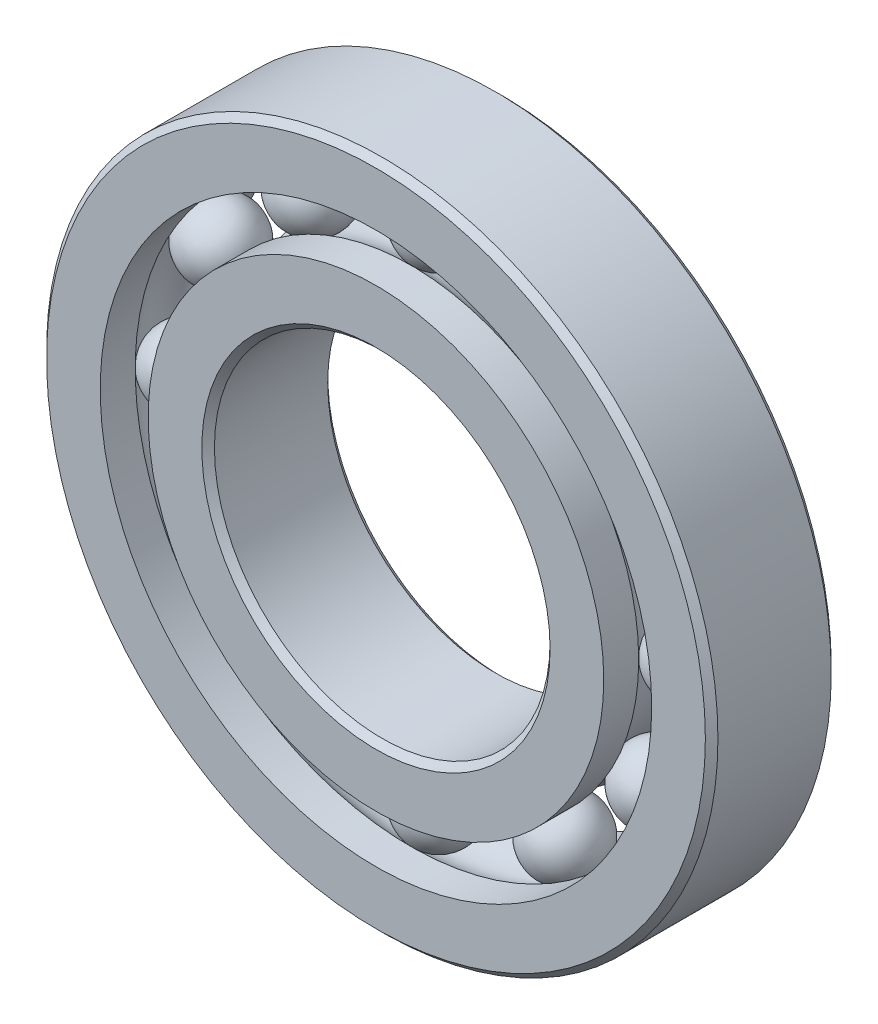
ISO-10303-21;
HEADER;
FILE_DESCRIPTION(('STEP AP214'),'2;1');
FILE_NAME('part.step','',(''),(''),'','','');
FILE_SCHEMA(('AUTOMOTIVE_DESIGN { 1 0 10303 214 1 1 1 1 }'));
ENDSEC;
DATA;
#1=APPLICATION_CONTEXT('core data for automotive mechanical design processes');
#2=APPLICATION_PROTOCOL_DEFINITION('international standard','automotive_design',2000,#1);
#3=PRODUCT_CONTEXT('',#1,'mechanical');
#4=PRODUCT('Part','Part','',(#3));
#5=PRODUCT_RELATED_PRODUCT_CATEGORY('part','',(#4));
#6=PRODUCT_DEFINITION_FORMATION('','',#4);
#7=PRODUCT_DEFINITION_CONTEXT('part definition',#1,'design');
#8=PRODUCT_DEFINITION('design','',#6,#7);
#9=PRODUCT_DEFINITION_SHAPE('','',#8);
#10=(LENGTH_UNIT() NAMED_UNIT(*) SI_UNIT(.MILLI.,.METRE.));
#11=(NAMED_UNIT(*) PLANE_ANGLE_UNIT() SI_UNIT($,.RADIAN.));
#12=(NAMED_UNIT(*) SI_UNIT($,.STERADIAN.) SOLID_ANGLE_UNIT());
#13=UNCERTAINTY_MEASURE_WITH_UNIT(LENGTH_MEASURE(1.E-05),#10,'distance_accuracy_value','');
#14=(GEOMETRIC_REPRESENTATION_CONTEXT(3) GLOBAL_UNCERTAINTY_ASSIGNED_CONTEXT((#13)) GLOBAL_UNIT_ASSIGNED_CONTEXT((#10,
#11,#12)) REPRESENTATION_CONTEXT('',''));
#15=CARTESIAN_POINT('',(0.,0.,0.));
#16=DIRECTION('',(0.,0.,1.));
#17=DIRECTION('',(1.,0.,0.));
#18=AXIS2_PLACEMENT_3D('',#15,#16,#17);
#19=CARTESIAN_POINT('',(-9.52499999999979,16.4977839420937,0.));
#20=DIRECTION('',(0.,0.,1.));
#21=DIRECTION('',(-0.499999999999989,0.866025403784445,0.));
#22=AXIS2_PLACEMENT_3D('',#19,#20,#21);
#23=SPHERICAL_SURFACE('',#22,2.78781463351475);
#24=CARTESIAN_POINT('',(-9.52499999999979,16.4977839420937,2.78781463351475));
#25=VERTEX_POINT('',#24);
#26=VERTEX_LOOP('',#25);
#27=FACE_BOUND('',#26,.T.);
#28=ADVANCED_FACE('F41',(#27),#23,.T.);
#29=CLOSED_SHELL('',(#28));
#30=MANIFOLD_SOLID_BREP('B2',#29);
#31=CARTESIAN_POINT('',(-16.4977839420934,9.52500000000019,0.));
#32=DIRECTION('',(0.,0.,1.));
#33=DIRECTION('',(-0.866025403784433,0.50000000000001,0.));
#34=AXIS2_PLACEMENT_3D('',#31,#32,#33);
#35=SPHERICAL_SURFACE('',#34,2.78781463351475);
#36=CARTESIAN_POINT('',(-16.4977839420934,9.52500000000019,2.78781463351475));
#37=VERTEX_POINT('',#36);
#38=VERTEX_LOOP('',#37);
#39=FACE_BOUND('',#38,.T.);
#40=ADVANCED_FACE('F61',(#39),#35,.T.);
#41=CLOSED_SHELL('',(#40));
#42=MANIFOLD_SOLID_BREP('B6',#41);
#43=CARTESIAN_POINT('',(-19.05,1.99538158514885E-13,0.));
#44=DIRECTION('',(0.,0.,1.));
#45=DIRECTION('',(-1.,0.,0.));
#46=AXIS2_PLACEMENT_3D('',#43,#44,#45);
#47=SPHERICAL_SURFACE('',#46,2.78781463351475);
#48=CARTESIAN_POINT('',(-19.05,1.99538158514885E-13,2.78781463351475));
#49=VERTEX_POINT('',#48);
#50=VERTEX_LOOP('',#49);
#51=FACE_BOUND('',#50,.T.);
#52=ADVANCED_FACE('F81',(#51),#47,.T.);
#53=CLOSED_SHELL('',(#52));
#54=MANIFOLD_SOLID_BREP('B37',#53);
#55=CARTESIAN_POINT('',(-16.4977839420936,-9.52499999999985,0.));
#56=DIRECTION('',(0.,0.,1.));
#57=DIRECTION('',(-0.866025403784443,-0.499999999999992,0.));
#58=AXIS2_PLACEMENT_3D('',#55,#56,#57);
#59=SPHERICAL_SURFACE('',#58,2.78781463351475);
#60=CARTESIAN_POINT('',(-16.4977839420936,-9.52499999999985,2.78781463351475));
#61=VERTEX_POINT('',#60);
#62=VERTEX_LOOP('',#61);
#63=FACE_BOUND('',#62,.T.);
#64=ADVANCED_FACE('F101',(#63),#59,.T.);
#65=CLOSED_SHELL('',(#64));
#66=MANIFOLD_SOLID_BREP('B57',#65);
#67=CARTESIAN_POINT('',(-9.52500000000013,-16.4977839420935,0.));
#68=DIRECTION('',(0.,0.,1.));
#69=DIRECTION('',(-0.500000000000007,-0.866025403784435,0.));
#70=AXIS2_PLACEMENT_3D('',#67,#68,#69);
#71=SPHERICAL_SURFACE('',#70,2.78781463351475);
#72=CARTESIAN_POINT('',(-9.52500000000013,-16.4977839420935,2.78781463351475));
#73=VERTEX_POINT('',#72);
#74=VERTEX_LOOP('',#73);
#75=FACE_BOUND('',#74,.T.);
#76=ADVANCED_FACE('F121',(#75),#71,.T.);
#77=CLOSED_SHELL('',(#76));
#78=MANIFOLD_SOLID_BREP('B77',#77);
#79=CARTESIAN_POINT('',(-1.33025439009923E-13,-19.05,0.));
#80=DIRECTION('',(0.,0.,1.));
#81=DIRECTION('',(0.,-1.,0.));
#82=AXIS2_PLACEMENT_3D('',#79,#80,#81);
#83=SPHERICAL_SURFACE('',#82,2.78781463351475);
#84=CARTESIAN_POINT('',(-1.33025439009923E-13,-19.05,2.78781463351475));
#85=VERTEX_POINT('',#84);
#86=VERTEX_LOOP('',#85);
#87=FACE_BOUND('',#86,.T.);
#88=ADVANCED_FACE('F141',(#87),#83,.T.);
#89=CLOSED_SHELL('',(#88));
#90=MANIFOLD_SOLID_BREP('B97',#89);
#91=CARTESIAN_POINT('',(9.5249999999999,-16.4977839420936,0.));
#92=DIRECTION('',(0.,0.,1.));
#93=DIRECTION('',(0.499999999999995,-0.866025403784442,0.));
#94=AXIS2_PLACEMENT_3D('',#91,#92,#93);
#95=SPHERICAL_SURFACE('',#94,2.78781463351475);
#96=CARTESIAN_POINT('',(9.5249999999999,-16.4977839420936,2.78781463351475));
#97=VERTEX_POINT('',#96);
#98=VERTEX_LOOP('',#97);
#99=FACE_BOUND('',#98,.T.);
#100=ADVANCED_FACE('F161',(#99),#95,.T.);
#101=CLOSED_SHELL('',(#100));
#102=MANIFOLD_SOLID_BREP('B117',#101);
#103=CARTESIAN_POINT('',(16.4977839420935,-9.52500000000008,0.));
#104=DIRECTION('',(0.,0.,1.));
#105=DIRECTION('',(0.866025403784436,-0.500000000000004,0.));
#106=AXIS2_PLACEMENT_3D('',#103,#104,#105);
#107=SPHERICAL_SURFACE('',#106,2.78781463351475);
#108=CARTESIAN_POINT('',(16.4977839420935,-9.52500000000008,2.78781463351475));
#109=VERTEX_POINT('',#108);
#110=VERTEX_LOOP('',#109);
#111=FACE_BOUND('',#110,.T.);
#112=ADVANCED_FACE('F181',(#111),#107,.T.);
#113=CLOSED_SHELL('',(#112));
#114=MANIFOLD_SOLID_BREP('B137',#113);
#115=CARTESIAN_POINT('',(19.05,0.,0.));
#116=DIRECTION('',(0.,0.,1.));
#117=DIRECTION('',(1.,0.,0.));
#118=AXIS2_PLACEMENT_3D('',#115,#116,#117);
#119=SPHERICAL_SURFACE('',#118,2.78781463351475);
#120=CARTESIAN_POINT('',(19.05,0.,2.78781463351475));
#121=VERTEX_POINT('',#120);
#122=VERTEX_LOOP('',#121);
#123=FACE_BOUND('',#122,.T.);
#124=ADVANCED_FACE('F201',(#123),#119,.T.);
#125=CLOSED_SHELL('',(#124));
#126=MANIFOLD_SOLID_BREP('B157',#125);
#127=CARTESIAN_POINT('',(16.4977839420936,9.52499999999996,0.));
#128=DIRECTION('',(0.,0.,1.));
#129=DIRECTION('',(0.86602540378444,0.499999999999998,0.));
#130=AXIS2_PLACEMENT_3D('',#127,#128,#129);
#131=SPHERICAL_SURFACE('',#130,2.78781463351475);
#132=CARTESIAN_POINT('',(16.4977839420936,9.52499999999996,2.78781463351475));
#133=VERTEX_POINT('',#132);
#134=VERTEX_LOOP('',#133);
#135=FACE_BOUND('',#134,.T.);
#136=ADVANCED_FACE('F221',(#135),#131,.T.);
#137=CLOSED_SHELL('',(#136));
#138=MANIFOLD_SOLID_BREP('B177',#137);
#139=CARTESIAN_POINT('',(9.52500000000002,16.4977839420935,0.));
#140=DIRECTION('',(0.,0.,1.));
#141=DIRECTION('',(0.500000000000001,0.866025403784438,0.));
#142=AXIS2_PLACEMENT_3D('',#139,#140,#141);
#143=SPHERICAL_SURFACE('',#142,2.78781463351475);
#144=CARTESIAN_POINT('',(9.52500000000002,16.4977839420935,2.78781463351475));
#145=VERTEX_POINT('',#144);
#146=VERTEX_LOOP('',#145);
#147=FACE_BOUND('',#146,.T.);
#148=ADVANCED_FACE('F241',(#147),#143,.T.);
#149=CLOSED_SHELL('',(#148));
#150=MANIFOLD_SOLID_BREP('B197',#149);
#151=CARTESIAN_POINT('',(0.,19.05,0.));
#152=DIRECTION('',(0.,0.,1.));
#153=DIRECTION('',(0.,1.,0.));
#154=AXIS2_PLACEMENT_3D('',#151,#152,#153);
#155=SPHERICAL_SURFACE('',#154,2.78781463351475);
#156=CARTESIAN_POINT('',(0.,19.05,2.78781463351475));
#157=VERTEX_POINT('',#156);
#158=VERTEX_LOOP('',#157);
#159=FACE_BOUND('',#158,.T.);
#160=ADVANCED_FACE('F263',(#159),#155,.T.);
#161=CLOSED_SHELL('',(#160));
#162=MANIFOLD_SOLID_BREP('B217',#161);
#163=CARTESIAN_POINT('',(0.,17.2357142857143,4.7625));
#164=DIRECTION('',(0.,0.,-1.));
#165=DIRECTION('',(-1.,0.,0.));
#166=AXIS2_PLACEMENT_3D('',#163,#164,#165);
#167=PLANE('',#166);
#168=CARTESIAN_POINT('',(0.,0.,4.7625));
#169=DIRECTION('',(0.,0.,1.));
#170=DIRECTION('',(1.,0.,0.));
#171=AXIS2_PLACEMENT_3D('',#168,#169,#170);
#172=CIRCLE('',#171,13.17625);
#173=CARTESIAN_POINT('',(13.17625,0.,4.7625));
#174=VERTEX_POINT('',#173);
#175=EDGE_CURVE('E310',#174,#174,#172,.T.);
#176=ORIENTED_EDGE('',*,*,#175,.F.);
#177=EDGE_LOOP('',(#176));
#178=FACE_BOUND('',#177,.T.);
#179=CARTESIAN_POINT('',(0.,0.,4.7625));
#180=DIRECTION('',(0.,0.,1.));
#181=DIRECTION('',(1.,0.,0.));
#182=AXIS2_PLACEMENT_3D('',#179,#180,#181);
#183=CIRCLE('',#182,17.2357142857143);
#184=CARTESIAN_POINT('',(17.2357142857143,0.,4.7625));
#185=VERTEX_POINT('',#184);
#186=EDGE_CURVE('E262',#185,#185,#183,.T.);
#187=ORIENTED_EDGE('',*,*,#186,.T.);
#188=EDGE_LOOP('',(#187));
#189=FACE_BOUND('',#188,.T.);
#190=ADVANCED_FACE('F282',(#178,#189),#167,.F.);
#191=CARTESIAN_POINT('',(0.,0.,4.7625));
#192=DIRECTION('',(0.,0.,1.));
#193=DIRECTION('',(1.,0.,0.));
#194=AXIS2_PLACEMENT_3D('',#191,#192,#193);
#195=CYLINDRICAL_SURFACE('',#194,17.2357142857143);
#196=ORIENTED_EDGE('',*,*,#186,.F.);
#197=EDGE_LOOP('',(#196));
#198=FACE_BOUND('',#197,.T.);
#199=CARTESIAN_POINT('',(0.,0.,2.11666666666667));
#200=DIRECTION('',(0.,0.,1.));
#201=DIRECTION('',(1.,0.,0.));
#202=AXIS2_PLACEMENT_3D('',#199,#200,#201);
#203=CIRCLE('',#202,17.2357142857143);
#204=CARTESIAN_POINT('',(17.2357142857143,0.,2.11666666666667));
#205=VERTEX_POINT('',#204);
#206=EDGE_CURVE('E288',#205,#205,#203,.T.);
#207=ORIENTED_EDGE('',*,*,#206,.T.);
#208=EDGE_LOOP('',(#207));
#209=FACE_BOUND('',#208,.T.);
#210=ADVANCED_FACE('F317',(#198,#209),#195,.T.);
#211=CARTESIAN_POINT('',(0.,0.,0.));
#212=DIRECTION('',(0.,0.,1.));
#213=DIRECTION('',(1.,0.,0.));
#214=AXIS2_PLACEMENT_3D('',#211,#212,#213);
#215=TOROIDAL_SURFACE('',#214,19.05,2.78781463351475);
#216=ORIENTED_EDGE('',*,*,#206,.F.);
#217=EDGE_LOOP('',(#216));
#218=FACE_BOUND('',#217,.T.);
#219=CARTESIAN_POINT('',(0.,0.,-2.11666666666667));
#220=DIRECTION('',(0.,0.,1.));
#221=DIRECTION('',(1.,0.,0.));
#222=AXIS2_PLACEMENT_3D('',#219,#220,#221);
#223=CIRCLE('',#222,17.2357142857143);
#224=CARTESIAN_POINT('',(17.2357142857143,0.,-2.11666666666667));
#225=VERTEX_POINT('',#224);
#226=EDGE_CURVE('E292',#225,#225,#223,.T.);
#227=ORIENTED_EDGE('',*,*,#226,.T.);
#228=EDGE_LOOP('',(#227));
#229=FACE_BOUND('',#228,.T.);
#230=ADVANCED_FACE('F321',(#218,#229),#215,.F.);
#231=CARTESIAN_POINT('',(0.,0.,4.7625));
#232=DIRECTION('',(0.,0.,1.));
#233=DIRECTION('',(1.,0.,0.));
#234=AXIS2_PLACEMENT_3D('',#231,#232,#233);
#235=CYLINDRICAL_SURFACE('',#234,17.2357142857143);
#236=ORIENTED_EDGE('',*,*,#226,.F.);
#237=EDGE_LOOP('',(#236));
#238=FACE_BOUND('',#237,.T.);
#239=CARTESIAN_POINT('',(0.,0.,-4.7625));
#240=DIRECTION('',(0.,0.,1.));
#241=DIRECTION('',(1.,0.,0.));
#242=AXIS2_PLACEMENT_3D('',#239,#240,#241);
#243=CIRCLE('',#242,17.2357142857143);
#244=CARTESIAN_POINT('',(17.2357142857143,0.,-4.7625));
#245=VERTEX_POINT('',#244);
#246=EDGE_CURVE('E296',#245,#245,#243,.T.);
#247=ORIENTED_EDGE('',*,*,#246,.T.);
#248=EDGE_LOOP('',(#247));
#249=FACE_BOUND('',#248,.T.);
#250=ADVANCED_FACE('F326',(#238,#249),#235,.T.);
#251=CARTESIAN_POINT('',(0.,13.17625,-4.7625));
#252=DIRECTION('',(0.,0.,1.));
#253=DIRECTION('',(1.,0.,0.));
#254=AXIS2_PLACEMENT_3D('',#251,#252,#253);
#255=PLANE('',#254);
#256=ORIENTED_EDGE('',*,*,#246,.F.);
#257=EDGE_LOOP('',(#256));
#258=FACE_BOUND('',#257,.T.);
#259=CARTESIAN_POINT('',(0.,0.,-4.7625));
#260=DIRECTION('',(0.,0.,1.));
#261=DIRECTION('',(1.,0.,0.));
#262=AXIS2_PLACEMENT_3D('',#259,#260,#261);
#263=CIRCLE('',#262,13.17625);
#264=CARTESIAN_POINT('',(13.17625,0.,-4.7625));
#265=VERTEX_POINT('',#264);
#266=EDGE_CURVE('E301',#265,#265,#263,.T.);
#267=ORIENTED_EDGE('',*,*,#266,.T.);
#268=EDGE_LOOP('',(#267));
#269=FACE_BOUND('',#268,.T.);
#270=ADVANCED_FACE('F332',(#258,#269),#255,.F.);
#271=CARTESIAN_POINT('',(0.,0.,-4.28625));
#272=DIRECTION('',(0.,0.,-1.));
#273=DIRECTION('',(-1.,0.,0.));
#274=AXIS2_PLACEMENT_3D('',#271,#272,#273);
#275=CONICAL_SURFACE('',#274,12.7,0.785398163397445);
#276=ORIENTED_EDGE('',*,*,#266,.F.);
#277=EDGE_LOOP('',(#276));
#278=FACE_BOUND('',#277,.T.);
#279=CARTESIAN_POINT('',(0.,0.,-4.28625));
#280=DIRECTION('',(0.,0.,1.));
#281=DIRECTION('',(1.,0.,0.));
#282=AXIS2_PLACEMENT_3D('',#279,#280,#281);
#283=CIRCLE('',#282,12.7);
#284=CARTESIAN_POINT('',(12.7,0.,-4.28625));
#285=VERTEX_POINT('',#284);
#286=EDGE_CURVE('E304',#285,#285,#283,.T.);
#287=ORIENTED_EDGE('',*,*,#286,.T.);
#288=EDGE_LOOP('',(#287));
#289=FACE_BOUND('',#288,.T.);
#290=ADVANCED_FACE('F336',(#278,#289),#275,.F.);
#291=CARTESIAN_POINT('',(0.,0.,4.7625));
#292=DIRECTION('',(0.,0.,1.));
#293=DIRECTION('',(1.,0.,0.));
#294=AXIS2_PLACEMENT_3D('',#291,#292,#293);
#295=CYLINDRICAL_SURFACE('',#294,12.7);
#296=ORIENTED_EDGE('',*,*,#286,.F.);
#297=EDGE_LOOP('',(#296));
#298=FACE_BOUND('',#297,.T.);
#299=CARTESIAN_POINT('',(0.,0.,4.28625000000001));
#300=DIRECTION('',(0.,0.,1.));
#301=DIRECTION('',(1.,0.,0.));
#302=AXIS2_PLACEMENT_3D('',#299,#300,#301);
#303=CIRCLE('',#302,12.7);
#304=CARTESIAN_POINT('',(12.7,0.,4.28625000000001));
#305=VERTEX_POINT('',#304);
#306=EDGE_CURVE('E307',#305,#305,#303,.T.);
#307=ORIENTED_EDGE('',*,*,#306,.T.);
#308=EDGE_LOOP('',(#307));
#309=FACE_BOUND('',#308,.T.);
#310=ADVANCED_FACE('F340',(#298,#309),#295,.F.);
#311=CARTESIAN_POINT('',(0.,0.,4.7625));
#312=DIRECTION('',(0.,0.,1.));
#313=DIRECTION('',(1.,0.,0.));
#314=AXIS2_PLACEMENT_3D('',#311,#312,#313);
#315=CONICAL_SURFACE('',#314,13.17625,0.785398163397452);
#316=ORIENTED_EDGE('',*,*,#306,.F.);
#317=EDGE_LOOP('',(#316));
#318=FACE_BOUND('',#317,.T.);
#319=ORIENTED_EDGE('',*,*,#175,.T.);
#320=EDGE_LOOP('',(#319));
#321=FACE_BOUND('',#320,.T.);
#322=ADVANCED_FACE('F314',(#318,#321),#315,.F.);
#323=CLOSED_SHELL('',(#190,#210,#230,#250,#270,#290,#310,#322));
#324=MANIFOLD_SOLID_BREP('B237',#323);
#325=CARTESIAN_POINT('',(0.,0.,4.28625));
#326=DIRECTION('',(0.,0.,-1.));
#327=DIRECTION('',(-1.,0.,0.));
#328=AXIS2_PLACEMENT_3D('',#325,#326,#327);
#329=CONICAL_SURFACE('',#328,25.4,0.785398163397446);
#330=CARTESIAN_POINT('',(0.,0.,4.7625));
#331=DIRECTION('',(0.,0.,1.));
#332=DIRECTION('',(1.,0.,0.));
#333=AXIS2_PLACEMENT_3D('',#330,#331,#332);
#334=CIRCLE('',#333,24.92375);
#335=CARTESIAN_POINT('',(24.92375,0.,4.7625));
#336=VERTEX_POINT('',#335);
#337=EDGE_CURVE('E431',#336,#336,#334,.T.);
#338=ORIENTED_EDGE('',*,*,#337,.F.);
#339=EDGE_LOOP('',(#338));
#340=FACE_BOUND('',#339,.T.);
#341=CARTESIAN_POINT('',(0.,0.,4.28625));
#342=DIRECTION('',(0.,0.,1.));
#343=DIRECTION('',(1.,0.,0.));
#344=AXIS2_PLACEMENT_3D('',#341,#342,#343);
#345=CIRCLE('',#344,25.4);
#346=CARTESIAN_POINT('',(25.4,0.,4.28625));
#347=VERTEX_POINT('',#346);
#348=EDGE_CURVE('E281',#347,#347,#345,.T.);
#349=ORIENTED_EDGE('',*,*,#348,.T.);
#350=EDGE_LOOP('',(#349));
#351=FACE_BOUND('',#350,.T.);
#352=ADVANCED_FACE('F403',(#340,#351),#329,.T.);
#353=CARTESIAN_POINT('',(0.,0.,4.7625));
#354=DIRECTION('',(0.,0.,1.));
#355=DIRECTION('',(1.,0.,0.));
#356=AXIS2_PLACEMENT_3D('',#353,#354,#355);
#357=CYLINDRICAL_SURFACE('',#356,25.4);
#358=ORIENTED_EDGE('',*,*,#348,.F.);
#359=EDGE_LOOP('',(#358));
#360=FACE_BOUND('',#359,.T.);
#361=CARTESIAN_POINT('',(0.,0.,-4.28625));
#362=DIRECTION('',(0.,0.,1.));
#363=DIRECTION('',(1.,0.,0.));
#364=AXIS2_PLACEMENT_3D('',#361,#362,#363);
#365=CIRCLE('',#364,25.4);
#366=CARTESIAN_POINT('',(25.4,0.,-4.28625));
#367=VERTEX_POINT('',#366);
#368=EDGE_CURVE('E409',#367,#367,#365,.T.);
#369=ORIENTED_EDGE('',*,*,#368,.T.);
#370=EDGE_LOOP('',(#369));
#371=FACE_BOUND('',#370,.T.);
#372=ADVANCED_FACE('F438',(#360,#371),#357,.T.);
#373=CARTESIAN_POINT('',(0.,0.,-4.7625));
#374=DIRECTION('',(0.,0.,1.));
#375=DIRECTION('',(1.,0.,0.));
#376=AXIS2_PLACEMENT_3D('',#373,#374,#375);
#377=CONICAL_SURFACE('',#376,24.92375,0.785398163397445);
#378=ORIENTED_EDGE('',*,*,#368,.F.);
#379=EDGE_LOOP('',(#378));
#380=FACE_BOUND('',#379,.T.);
#381=CARTESIAN_POINT('',(0.,0.,-4.7625));
#382=DIRECTION('',(0.,0.,1.));
#383=DIRECTION('',(1.,0.,0.));
#384=AXIS2_PLACEMENT_3D('',#381,#382,#383);
#385=CIRCLE('',#384,24.92375);
#386=CARTESIAN_POINT('',(24.92375,0.,-4.7625));
#387=VERTEX_POINT('',#386);
#388=EDGE_CURVE('E413',#387,#387,#385,.T.);
#389=ORIENTED_EDGE('',*,*,#388,.T.);
#390=EDGE_LOOP('',(#389));
#391=FACE_BOUND('',#390,.T.);
#392=ADVANCED_FACE('F442',(#380,#391),#377,.T.);
#393=CARTESIAN_POINT('',(0.,24.92375,-4.7625));
#394=DIRECTION('',(0.,0.,1.));
#395=DIRECTION('',(1.,0.,0.));
#396=AXIS2_PLACEMENT_3D('',#393,#394,#395);
#397=PLANE('',#396);
#398=ORIENTED_EDGE('',*,*,#388,.F.);
#399=EDGE_LOOP('',(#398));
#400=FACE_BOUND('',#399,.T.);
#401=CARTESIAN_POINT('',(0.,0.,-4.7625));
#402=DIRECTION('',(0.,0.,1.));
#403=DIRECTION('',(1.,0.,0.));
#404=AXIS2_PLACEMENT_3D('',#401,#402,#403);
#405=CIRCLE('',#404,20.8642857142857);
#406=CARTESIAN_POINT('',(20.8642857142857,0.,-4.7625));
#407=VERTEX_POINT('',#406);
#408=EDGE_CURVE('E417',#407,#407,#405,.T.);
#409=ORIENTED_EDGE('',*,*,#408,.T.);
#410=EDGE_LOOP('',(#409));
#411=FACE_BOUND('',#410,.T.);
#412=ADVANCED_FACE('F447',(#400,#411),#397,.F.);
#413=CARTESIAN_POINT('',(0.,0.,4.7625));
#414=DIRECTION('',(0.,0.,1.));
#415=DIRECTION('',(1.,0.,0.));
#416=AXIS2_PLACEMENT_3D('',#413,#414,#415);
#417=CYLINDRICAL_SURFACE('',#416,20.8642857142857);
#418=ORIENTED_EDGE('',*,*,#408,.F.);
#419=EDGE_LOOP('',(#418));
#420=FACE_BOUND('',#419,.T.);
#421=CARTESIAN_POINT('',(0.,0.,-2.11666666666667));
#422=DIRECTION('',(0.,0.,1.));
#423=DIRECTION('',(1.,0.,0.));
#424=AXIS2_PLACEMENT_3D('',#421,#422,#423);
#425=CIRCLE('',#424,20.8642857142857);
#426=CARTESIAN_POINT('',(20.8642857142857,0.,-2.11666666666667));
#427=VERTEX_POINT('',#426);
#428=EDGE_CURVE('E422',#427,#427,#425,.T.);
#429=ORIENTED_EDGE('',*,*,#428,.T.);
#430=EDGE_LOOP('',(#429));
#431=FACE_BOUND('',#430,.T.);
#432=ADVANCED_FACE('F453',(#420,#431),#417,.F.);
#433=CARTESIAN_POINT('',(0.,0.,0.));
#434=DIRECTION('',(0.,0.,1.));
#435=DIRECTION('',(1.,0.,0.));
#436=AXIS2_PLACEMENT_3D('',#433,#434,#435);
#437=TOROIDAL_SURFACE('',#436,19.05,2.78781463351476);
#438=ORIENTED_EDGE('',*,*,#428,.F.);
#439=EDGE_LOOP('',(#438));
#440=FACE_BOUND('',#439,.T.);
#441=CARTESIAN_POINT('',(0.,0.,2.11666666666667));
#442=DIRECTION('',(0.,0.,1.));
#443=DIRECTION('',(1.,0.,0.));
#444=AXIS2_PLACEMENT_3D('',#441,#442,#443);
#445=CIRCLE('',#444,20.8642857142857);
#446=CARTESIAN_POINT('',(20.8642857142857,0.,2.11666666666667));
#447=VERTEX_POINT('',#446);
#448=EDGE_CURVE('E425',#447,#447,#445,.T.);
#449=ORIENTED_EDGE('',*,*,#448,.T.);
#450=EDGE_LOOP('',(#449));
#451=FACE_BOUND('',#450,.T.);
#452=ADVANCED_FACE('F457',(#440,#451),#437,.F.);
#453=CARTESIAN_POINT('',(0.,0.,4.7625));
#454=DIRECTION('',(0.,0.,1.));
#455=DIRECTION('',(1.,0.,0.));
#456=AXIS2_PLACEMENT_3D('',#453,#454,#455);
#457=CYLINDRICAL_SURFACE('',#456,20.8642857142857);
#458=ORIENTED_EDGE('',*,*,#448,.F.);
#459=EDGE_LOOP('',(#458));
#460=FACE_BOUND('',#459,.T.);
#461=CARTESIAN_POINT('',(0.,0.,4.7625));
#462=DIRECTION('',(0.,0.,1.));
#463=DIRECTION('',(1.,0.,0.));
#464=AXIS2_PLACEMENT_3D('',#461,#462,#463);
#465=CIRCLE('',#464,20.8642857142857);
#466=CARTESIAN_POINT('',(20.8642857142857,0.,4.7625));
#467=VERTEX_POINT('',#466);
#468=EDGE_CURVE('E428',#467,#467,#465,.T.);
#469=ORIENTED_EDGE('',*,*,#468,.T.);
#470=EDGE_LOOP('',(#469));
#471=FACE_BOUND('',#470,.T.);
#472=ADVANCED_FACE('F461',(#460,#471),#457,.F.);
#473=CARTESIAN_POINT('',(0.,24.92375,4.7625));
#474=DIRECTION('',(0.,0.,-1.));
#475=DIRECTION('',(-1.,0.,0.));
#476=AXIS2_PLACEMENT_3D('',#473,#474,#475);
#477=PLANE('',#476);
#478=ORIENTED_EDGE('',*,*,#468,.F.);
#479=EDGE_LOOP('',(#478));
#480=FACE_BOUND('',#479,.T.);
#481=ORIENTED_EDGE('',*,*,#337,.T.);
#482=EDGE_LOOP('',(#481));
#483=FACE_BOUND('',#482,.T.);
#484=ADVANCED_FACE('F435',(#480,#483),#477,.F.);
#485=CLOSED_SHELL('',(#352,#372,#392,#412,#432,#452,#472,#484));
#486=MANIFOLD_SOLID_BREP('B257',#485);
#487=ADVANCED_BREP_SHAPE_REPRESENTATION('',(#18,#30,#42,#54,#66,#78,#90,#102,#114,#126,#138,
#150,#162,#324,#486),#14);
#488=SHAPE_DEFINITION_REPRESENTATION(#9,#487);
ENDSEC;
END-ISO-10303-21;
